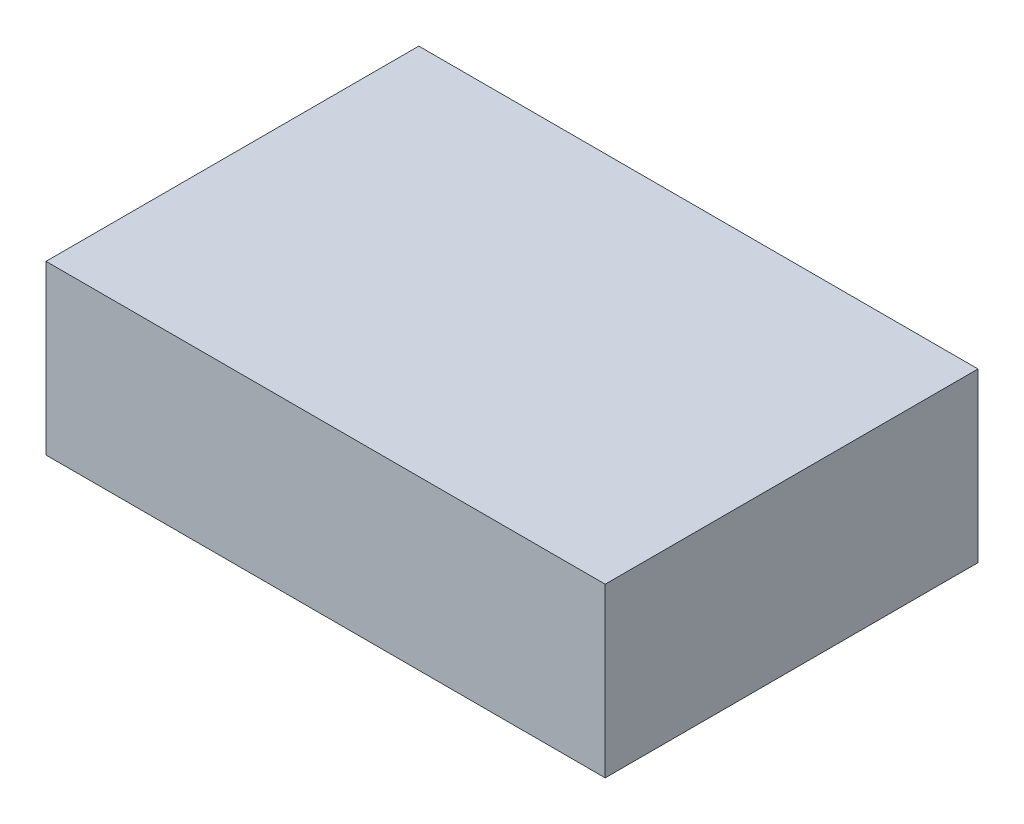
ISO-10303-21;
HEADER;
FILE_DESCRIPTION(('STEP AP214'),'2;1');
FILE_NAME('part.step','',(''),(''),'','','');
FILE_SCHEMA(('AUTOMOTIVE_DESIGN { 1 0 10303 214 1 1 1 1 }'));
ENDSEC;
DATA;
#1=APPLICATION_CONTEXT('core data for automotive mechanical design processes');
#2=APPLICATION_PROTOCOL_DEFINITION('international standard','automotive_design',2000,#1);
#3=PRODUCT_CONTEXT('',#1,'mechanical');
#4=PRODUCT('Part','Part','',(#3));
#5=PRODUCT_RELATED_PRODUCT_CATEGORY('part','',(#4));
#6=PRODUCT_DEFINITION_FORMATION('','',#4);
#7=PRODUCT_DEFINITION_CONTEXT('part definition',#1,'design');
#8=PRODUCT_DEFINITION('design','',#6,#7);
#9=PRODUCT_DEFINITION_SHAPE('','',#8);
#10=(LENGTH_UNIT() NAMED_UNIT(*) SI_UNIT(.MILLI.,.METRE.));
#11=(NAMED_UNIT(*) PLANE_ANGLE_UNIT() SI_UNIT($,.RADIAN.));
#12=(NAMED_UNIT(*) SI_UNIT($,.STERADIAN.) SOLID_ANGLE_UNIT());
#13=UNCERTAINTY_MEASURE_WITH_UNIT(LENGTH_MEASURE(1.E-05),#10,'distance_accuracy_value','');
#14=(GEOMETRIC_REPRESENTATION_CONTEXT(3) GLOBAL_UNCERTAINTY_ASSIGNED_CONTEXT((#13)) GLOBAL_UNIT_ASSIGNED_CONTEXT((#10,
#11,#12)) REPRESENTATION_CONTEXT('',''));
#15=CARTESIAN_POINT('',(0.,0.,0.));
#16=DIRECTION('',(0.,0.,1.));
#17=DIRECTION('',(1.,0.,0.));
#18=AXIS2_PLACEMENT_3D('',#15,#16,#17);
#19=CARTESIAN_POINT('',(15.,9.,10.));
#20=DIRECTION('',(-1.,0.,0.));
#21=DIRECTION('',(0.,0.,1.));
#22=AXIS2_PLACEMENT_3D('',#19,#20,#21);
#23=PLANE('',#22);
#24=DIRECTION('',(0.,0.,-1.));
#25=VECTOR('',#24,1.);
#26=CARTESIAN_POINT('',(15.,0.,10.));
#27=LINE('',#26,#25);
#28=CARTESIAN_POINT('',(15.,0.,10.));
#29=VERTEX_POINT('',#28);
#30=CARTESIAN_POINT('',(15.,0.,-10.));
#31=VERTEX_POINT('',#30);
#32=EDGE_CURVE('E100',#29,#31,#27,.T.);
#33=ORIENTED_EDGE('',*,*,#32,.T.);
#34=DIRECTION('',(0.,-1.,0.));
#35=VECTOR('',#34,1.);
#36=CARTESIAN_POINT('',(15.,9.,-10.));
#37=LINE('',#36,#35);
#38=CARTESIAN_POINT('',(15.,9.,-10.));
#39=VERTEX_POINT('',#38);
#40=EDGE_CURVE('E11',#39,#31,#37,.T.);
#41=ORIENTED_EDGE('',*,*,#40,.F.);
#42=DIRECTION('',(0.,0.,-1.));
#43=VECTOR('',#42,1.);
#44=CARTESIAN_POINT('',(15.,9.,10.));
#45=LINE('',#44,#43);
#46=CARTESIAN_POINT('',(15.,9.,10.));
#47=VERTEX_POINT('',#46);
#48=EDGE_CURVE('E88',#47,#39,#45,.T.);
#49=ORIENTED_EDGE('',*,*,#48,.F.);
#50=DIRECTION('',(0.,-1.,0.));
#51=VECTOR('',#50,1.);
#52=CARTESIAN_POINT('',(15.,9.,10.));
#53=LINE('',#52,#51);
#54=EDGE_CURVE('E96',#47,#29,#53,.T.);
#55=ORIENTED_EDGE('',*,*,#54,.T.);
#56=EDGE_LOOP('',(#33,#41,#49,#55));
#57=FACE_BOUND('',#56,.T.);
#58=ADVANCED_FACE('F37',(#57),#23,.F.);
#59=CARTESIAN_POINT('',(-15.,9.,-10.));
#60=DIRECTION('',(0.,0.,1.));
#61=DIRECTION('',(1.,0.,0.));
#62=AXIS2_PLACEMENT_3D('',#59,#60,#61);
#63=PLANE('',#62);
#64=DIRECTION('',(-1.,0.,0.));
#65=VECTOR('',#64,1.);
#66=CARTESIAN_POINT('',(-15.,0.,-10.));
#67=LINE('',#66,#65);
#68=CARTESIAN_POINT('',(-15.,0.,-10.));
#69=VERTEX_POINT('',#68);
#70=EDGE_CURVE('E92',#31,#69,#67,.T.);
#71=ORIENTED_EDGE('',*,*,#70,.T.);
#72=DIRECTION('',(0.,-1.,0.));
#73=VECTOR('',#72,1.);
#74=CARTESIAN_POINT('',(-15.,9.,-10.));
#75=LINE('',#74,#73);
#76=CARTESIAN_POINT('',(-15.,9.,-10.));
#77=VERTEX_POINT('',#76);
#78=EDGE_CURVE('E45',#77,#69,#75,.T.);
#79=ORIENTED_EDGE('',*,*,#78,.F.);
#80=DIRECTION('',(-1.,0.,0.));
#81=VECTOR('',#80,1.);
#82=CARTESIAN_POINT('',(-15.,9.,-10.));
#83=LINE('',#82,#81);
#84=EDGE_CURVE('E83',#39,#77,#83,.T.);
#85=ORIENTED_EDGE('',*,*,#84,.F.);
#86=ORIENTED_EDGE('',*,*,#40,.T.);
#87=EDGE_LOOP('',(#71,#79,#85,#86));
#88=FACE_BOUND('',#87,.T.);
#89=ADVANCED_FACE('F91',(#88),#63,.F.);
#90=CARTESIAN_POINT('',(-15.,9.,10.));
#91=DIRECTION('',(1.,0.,0.));
#92=DIRECTION('',(0.,0.,-1.));
#93=AXIS2_PLACEMENT_3D('',#90,#91,#92);
#94=PLANE('',#93);
#95=DIRECTION('',(0.,0.,1.));
#96=VECTOR('',#95,1.);
#97=CARTESIAN_POINT('',(-15.,0.,10.));
#98=LINE('',#97,#96);
#99=CARTESIAN_POINT('',(-15.,0.,10.));
#100=VERTEX_POINT('',#99);
#101=EDGE_CURVE('E70',#69,#100,#98,.T.);
#102=ORIENTED_EDGE('',*,*,#101,.T.);
#103=DIRECTION('',(0.,-1.,0.));
#104=VECTOR('',#103,1.);
#105=CARTESIAN_POINT('',(-15.,9.,10.));
#106=LINE('',#105,#104);
#107=CARTESIAN_POINT('',(-15.,9.,10.));
#108=VERTEX_POINT('',#107);
#109=EDGE_CURVE('E93',#108,#100,#106,.T.);
#110=ORIENTED_EDGE('',*,*,#109,.F.);
#111=DIRECTION('',(0.,0.,1.));
#112=VECTOR('',#111,1.);
#113=CARTESIAN_POINT('',(-15.,9.,10.));
#114=LINE('',#113,#112);
#115=EDGE_CURVE('E86',#77,#108,#114,.T.);
#116=ORIENTED_EDGE('',*,*,#115,.F.);
#117=ORIENTED_EDGE('',*,*,#78,.T.);
#118=EDGE_LOOP('',(#102,#110,#116,#117));
#119=FACE_BOUND('',#118,.T.);
#120=ADVANCED_FACE('F94',(#119),#94,.F.);
#121=CARTESIAN_POINT('',(-15.,9.,10.));
#122=DIRECTION('',(0.,0.,-1.));
#123=DIRECTION('',(-1.,0.,0.));
#124=AXIS2_PLACEMENT_3D('',#121,#122,#123);
#125=PLANE('',#124);
#126=DIRECTION('',(1.,0.,0.));
#127=VECTOR('',#126,1.);
#128=CARTESIAN_POINT('',(-15.,0.,10.));
#129=LINE('',#128,#127);
#130=EDGE_CURVE('E76',#100,#29,#129,.T.);
#131=ORIENTED_EDGE('',*,*,#130,.T.);
#132=ORIENTED_EDGE('',*,*,#54,.F.);
#133=DIRECTION('',(1.,0.,0.));
#134=VECTOR('',#133,1.);
#135=CARTESIAN_POINT('',(-15.,9.,10.));
#136=LINE('',#135,#134);
#137=EDGE_CURVE('E53',#108,#47,#136,.T.);
#138=ORIENTED_EDGE('',*,*,#137,.F.);
#139=ORIENTED_EDGE('',*,*,#109,.T.);
#140=EDGE_LOOP('',(#131,#132,#138,#139));
#141=FACE_BOUND('',#140,.T.);
#142=ADVANCED_FACE('F107',(#141),#125,.F.);
#143=CARTESIAN_POINT('',(0.,9.,0.));
#144=DIRECTION('',(0.,-1.,0.));
#145=DIRECTION('',(0.,0.,-1.));
#146=AXIS2_PLACEMENT_3D('',#143,#144,#145);
#147=PLANE('',#146);
#148=ORIENTED_EDGE('',*,*,#48,.T.);
#149=ORIENTED_EDGE('',*,*,#84,.T.);
#150=ORIENTED_EDGE('',*,*,#115,.T.);
#151=ORIENTED_EDGE('',*,*,#137,.T.);
#152=EDGE_LOOP('',(#148,#149,#150,#151));
#153=FACE_BOUND('',#152,.T.);
#154=ADVANCED_FACE('F84',(#153),#147,.F.);
#155=CARTESIAN_POINT('',(0.,0.,0.));
#156=DIRECTION('',(0.,-1.,0.));
#157=DIRECTION('',(0.,0.,-1.));
#158=AXIS2_PLACEMENT_3D('',#155,#156,#157);
#159=PLANE('',#158);
#160=ORIENTED_EDGE('',*,*,#32,.F.);
#161=ORIENTED_EDGE('',*,*,#130,.F.);
#162=ORIENTED_EDGE('',*,*,#101,.F.);
#163=ORIENTED_EDGE('',*,*,#70,.F.);
#164=EDGE_LOOP('',(#160,#161,#162,#163));
#165=FACE_BOUND('',#164,.T.);
#166=ADVANCED_FACE('F110',(#165),#159,.T.);
#167=CLOSED_SHELL('',(#58,#89,#120,#142,#154,#166));
#168=MANIFOLD_SOLID_BREP('B2',#167);
#169=ADVANCED_BREP_SHAPE_REPRESENTATION('',(#18,#168),#14);
#170=SHAPE_DEFINITION_REPRESENTATION(#9,#169);
ENDSEC;
END-ISO-10303-21;
